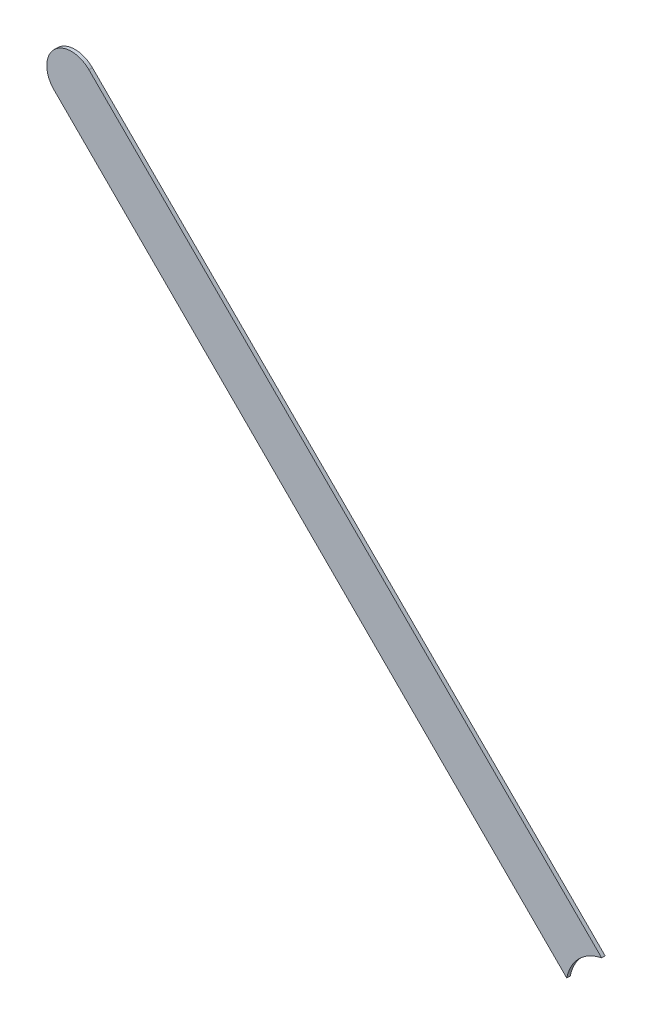
ISO-10303-21;
HEADER;
FILE_DESCRIPTION(('STEP AP214'),'2;1');
FILE_NAME('part.step','',(''),(''),'','','');
FILE_SCHEMA(('AUTOMOTIVE_DESIGN { 1 0 10303 214 1 1 1 1 }'));
ENDSEC;
DATA;
#1=APPLICATION_CONTEXT('core data for automotive mechanical design processes');
#2=APPLICATION_PROTOCOL_DEFINITION('international standard','automotive_design',2000,#1);
#3=PRODUCT_CONTEXT('',#1,'mechanical');
#4=PRODUCT('Part','Part','',(#3));
#5=PRODUCT_RELATED_PRODUCT_CATEGORY('part','',(#4));
#6=PRODUCT_DEFINITION_FORMATION('','',#4);
#7=PRODUCT_DEFINITION_CONTEXT('part definition',#1,'design');
#8=PRODUCT_DEFINITION('design','',#6,#7);
#9=PRODUCT_DEFINITION_SHAPE('','',#8);
#10=(LENGTH_UNIT() NAMED_UNIT(*) SI_UNIT(.MILLI.,.METRE.));
#11=(NAMED_UNIT(*) PLANE_ANGLE_UNIT() SI_UNIT($,.RADIAN.));
#12=(NAMED_UNIT(*) SI_UNIT($,.STERADIAN.) SOLID_ANGLE_UNIT());
#13=UNCERTAINTY_MEASURE_WITH_UNIT(LENGTH_MEASURE(1.E-05),#10,'distance_accuracy_value','');
#14=(GEOMETRIC_REPRESENTATION_CONTEXT(3) GLOBAL_UNCERTAINTY_ASSIGNED_CONTEXT((#13)) GLOBAL_UNIT_ASSIGNED_CONTEXT((#10,
#11,#12)) REPRESENTATION_CONTEXT('',''));
#15=CARTESIAN_POINT('',(0.,0.,0.));
#16=DIRECTION('',(0.,0.,1.));
#17=DIRECTION('',(1.,0.,0.));
#18=AXIS2_PLACEMENT_3D('',#15,#16,#17);
#19=CARTESIAN_POINT('',(111.56323382,62.82322462,0.));
#20=DIRECTION('',(0.707106781186547,0.707106781186549,0.));
#21=DIRECTION('',(0.707106781186549,-0.707106781186547,0.));
#22=AXIS2_PLACEMENT_3D('',#19,#20,#21);
#23=PLANE('',#22);
#24=DIRECTION('',(0.707106781186549,-0.707106781186547,0.));
#25=VECTOR('',#24,1.);
#26=CARTESIAN_POINT('',(111.56323382,62.82322462,0.03556));
#27=LINE('',#26,#25);
#28=CARTESIAN_POINT('',(111.56323382,62.82322462,0.03556));
#29=VERTEX_POINT('',#28);
#30=CARTESIAN_POINT('',(116.758668643605,57.6277897963948,0.03556));
#31=VERTEX_POINT('',#30);
#32=EDGE_CURVE('E11',#29,#31,#27,.T.);
#33=ORIENTED_EDGE('',*,*,#32,.F.);
#34=DIRECTION('',(0.,0.,1.));
#35=VECTOR('',#34,1.);
#36=CARTESIAN_POINT('',(111.56323382,62.82322462,0.));
#37=LINE('',#36,#35);
#38=CARTESIAN_POINT('',(111.56323382,62.82322462,0.));
#39=VERTEX_POINT('',#38);
#40=EDGE_CURVE('E24',#39,#29,#37,.T.);
#41=ORIENTED_EDGE('',*,*,#40,.F.);
#42=DIRECTION('',(0.707106781186549,-0.707106781186547,0.));
#43=VECTOR('',#42,1.);
#44=CARTESIAN_POINT('',(111.56323382,62.82322462,0.));
#45=LINE('',#44,#43);
#46=CARTESIAN_POINT('',(116.758668643605,57.6277897963948,0.));
#47=VERTEX_POINT('',#46);
#48=EDGE_CURVE('E75',#39,#47,#45,.T.);
#49=ORIENTED_EDGE('',*,*,#48,.T.);
#50=DIRECTION('',(0.,0.,1.));
#51=VECTOR('',#50,1.);
#52=CARTESIAN_POINT('',(116.758668643605,57.6277897963948,0.));
#53=LINE('',#52,#51);
#54=EDGE_CURVE('E37',#47,#31,#53,.T.);
#55=ORIENTED_EDGE('',*,*,#54,.T.);
#56=EDGE_LOOP('',(#33,#41,#49,#55));
#57=FACE_BOUND('',#56,.T.);
#58=ADVANCED_FACE('F17',(#57),#23,.F.);
#59=CARTESIAN_POINT('',(117.2000196,57.5399916,0.));
#60=DIRECTION('',(0.,0.,-1.));
#61=DIRECTION('',(1.,0.,0.));
#62=AXIS2_PLACEMENT_3D('',#59,#60,#61);
#63=CYLINDRICAL_SURFACE('',#62,0.4499991);
#64=DIRECTION('',(0.,0.,1.));
#65=VECTOR('',#64,1.);
#66=CARTESIAN_POINT('',(117.112221403605,57.9813425563948,0.));
#67=LINE('',#66,#65);
#68=CARTESIAN_POINT('',(117.112221403605,57.9813425563948,0.));
#69=VERTEX_POINT('',#68);
#70=CARTESIAN_POINT('',(117.112221403605,57.9813425563948,0.03556));
#71=VERTEX_POINT('',#70);
#72=EDGE_CURVE('E67',#69,#71,#67,.T.);
#73=ORIENTED_EDGE('',*,*,#72,.T.);
#74=CARTESIAN_POINT('',(117.2000196,57.5399916,0.03556));
#75=DIRECTION('',(0.,0.,1.));
#76=DIRECTION('',(1.,0.,0.));
#77=AXIS2_PLACEMENT_3D('',#74,#75,#76);
#78=CIRCLE('',#77,0.4499991);
#79=EDGE_CURVE('E82',#71,#31,#78,.T.);
#80=ORIENTED_EDGE('',*,*,#79,.T.);
#81=ORIENTED_EDGE('',*,*,#54,.F.);
#82=CARTESIAN_POINT('',(117.2000196,57.5399916,0.));
#83=DIRECTION('',(0.,0.,1.));
#84=DIRECTION('',(1.,0.,0.));
#85=AXIS2_PLACEMENT_3D('',#82,#83,#84);
#86=CIRCLE('',#85,0.4499991);
#87=EDGE_CURVE('E80',#69,#47,#86,.T.);
#88=ORIENTED_EDGE('',*,*,#87,.F.);
#89=EDGE_LOOP('',(#73,#80,#81,#88));
#90=FACE_BOUND('',#89,.T.);
#91=ADVANCED_FACE('F88',(#90),#63,.F.);
#92=CARTESIAN_POINT('',(117.112221403605,57.9813425563948,0.));
#93=DIRECTION('',(-0.707106781186549,-0.707106781186546,0.));
#94=DIRECTION('',(-0.707106781186546,0.707106781186549,0.));
#95=AXIS2_PLACEMENT_3D('',#92,#93,#94);
#96=PLANE('',#95);
#97=DIRECTION('',(-0.707106781186546,0.707106781186549,0.));
#98=VECTOR('',#97,1.);
#99=CARTESIAN_POINT('',(117.37679598,57.71676798,0.03556));
#100=LINE('',#99,#98);
#101=CARTESIAN_POINT('',(111.91678658,63.17677738,0.03556));
#102=VERTEX_POINT('',#101);
#103=EDGE_CURVE('E71',#71,#102,#100,.T.);
#104=ORIENTED_EDGE('',*,*,#103,.F.);
#105=ORIENTED_EDGE('',*,*,#72,.F.);
#106=DIRECTION('',(-0.707106781186546,0.707106781186549,0.));
#107=VECTOR('',#106,1.);
#108=CARTESIAN_POINT('',(117.37679598,57.71676798,0.));
#109=LINE('',#108,#107);
#110=CARTESIAN_POINT('',(111.91678658,63.17677738,0.));
#111=VERTEX_POINT('',#110);
#112=EDGE_CURVE('E63',#69,#111,#109,.T.);
#113=ORIENTED_EDGE('',*,*,#112,.T.);
#114=DIRECTION('',(0.,0.,1.));
#115=VECTOR('',#114,1.);
#116=CARTESIAN_POINT('',(111.91678658,63.17677738,0.));
#117=LINE('',#116,#115);
#118=EDGE_CURVE('E53',#111,#102,#117,.T.);
#119=ORIENTED_EDGE('',*,*,#118,.T.);
#120=EDGE_LOOP('',(#104,#105,#113,#119));
#121=FACE_BOUND('',#120,.T.);
#122=ADVANCED_FACE('F66',(#121),#96,.F.);
#123=CARTESIAN_POINT('',(111.7400102,63.000001,0.));
#124=DIRECTION('',(0.,0.,-1.));
#125=DIRECTION('',(0.707106781186562,0.707106781186533,0.));
#126=AXIS2_PLACEMENT_3D('',#123,#124,#125);
#127=CYLINDRICAL_SURFACE('',#126,0.249999554103226);
#128=CARTESIAN_POINT('',(111.7400102,63.000001,0.03556));
#129=DIRECTION('',(0.,0.,1.));
#130=DIRECTION('',(0.707106781186562,0.707106781186533,0.));
#131=AXIS2_PLACEMENT_3D('',#128,#129,#130);
#132=CIRCLE('',#131,0.249999554103226);
#133=EDGE_CURVE('E59',#102,#29,#132,.T.);
#134=ORIENTED_EDGE('',*,*,#133,.F.);
#135=ORIENTED_EDGE('',*,*,#118,.F.);
#136=CARTESIAN_POINT('',(111.7400102,63.000001,0.));
#137=DIRECTION('',(0.,0.,1.));
#138=DIRECTION('',(0.707106781186562,0.707106781186533,0.));
#139=AXIS2_PLACEMENT_3D('',#136,#137,#138);
#140=CIRCLE('',#139,0.249999554103226);
#141=EDGE_CURVE('E57',#111,#39,#140,.T.);
#142=ORIENTED_EDGE('',*,*,#141,.T.);
#143=ORIENTED_EDGE('',*,*,#40,.T.);
#144=EDGE_LOOP('',(#134,#135,#142,#143));
#145=FACE_BOUND('',#144,.T.);
#146=ADVANCED_FACE('F55',(#145),#127,.T.);
#147=CARTESIAN_POINT('',(111.56323382,62.82322462,0.));
#148=DIRECTION('',(0.,0.,-1.));
#149=DIRECTION('',(-1.,0.,0.));
#150=AXIS2_PLACEMENT_3D('',#147,#148,#149);
#151=PLANE('',#150);
#152=ORIENTED_EDGE('',*,*,#48,.F.);
#153=ORIENTED_EDGE('',*,*,#141,.F.);
#154=ORIENTED_EDGE('',*,*,#112,.F.);
#155=ORIENTED_EDGE('',*,*,#87,.T.);
#156=EDGE_LOOP('',(#152,#153,#154,#155));
#157=FACE_BOUND('',#156,.T.);
#158=ADVANCED_FACE('F74',(#157),#151,.T.);
#159=CARTESIAN_POINT('',(111.56323382,62.82322462,0.03556));
#160=DIRECTION('',(0.,0.,-1.));
#161=DIRECTION('',(-1.,0.,0.));
#162=AXIS2_PLACEMENT_3D('',#159,#160,#161);
#163=PLANE('',#162);
#164=ORIENTED_EDGE('',*,*,#133,.T.);
#165=ORIENTED_EDGE('',*,*,#32,.T.);
#166=ORIENTED_EDGE('',*,*,#79,.F.);
#167=ORIENTED_EDGE('',*,*,#103,.T.);
#168=EDGE_LOOP('',(#164,#165,#166,#167));
#169=FACE_BOUND('',#168,.T.);
#170=ADVANCED_FACE('F91',(#169),#163,.F.);
#171=CLOSED_SHELL('',(#58,#91,#122,#146,#158,#170));
#172=MANIFOLD_SOLID_BREP('B1',#171);
#173=ADVANCED_BREP_SHAPE_REPRESENTATION('',(#18,#172),#14);
#174=SHAPE_DEFINITION_REPRESENTATION(#9,#173);
ENDSEC;
END-ISO-10303-21;
